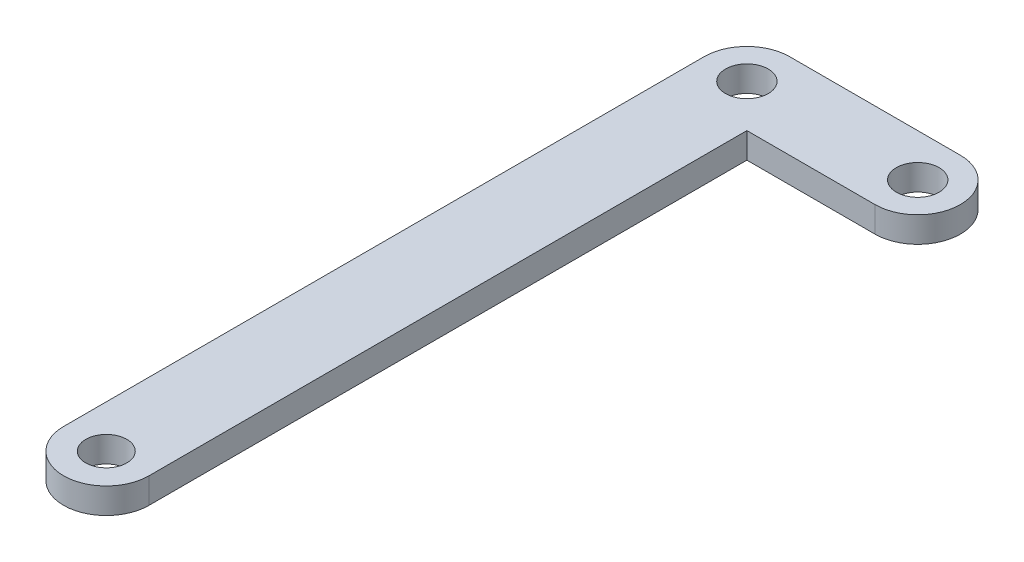
ISO-10303-21;
HEADER;
FILE_DESCRIPTION(('STEP AP214'),'2;1');
FILE_NAME('part.step','',(''),(''),'','','');
FILE_SCHEMA(('AUTOMOTIVE_DESIGN { 1 0 10303 214 1 1 1 1 }'));
ENDSEC;
DATA;
#1=APPLICATION_CONTEXT('core data for automotive mechanical design processes');
#2=APPLICATION_PROTOCOL_DEFINITION('international standard','automotive_design',2000,#1);
#3=PRODUCT_CONTEXT('',#1,'mechanical');
#4=PRODUCT('Part','Part','',(#3));
#5=PRODUCT_RELATED_PRODUCT_CATEGORY('part','',(#4));
#6=PRODUCT_DEFINITION_FORMATION('','',#4);
#7=PRODUCT_DEFINITION_CONTEXT('part definition',#1,'design');
#8=PRODUCT_DEFINITION('design','',#6,#7);
#9=PRODUCT_DEFINITION_SHAPE('','',#8);
#10=(LENGTH_UNIT() NAMED_UNIT(*) SI_UNIT(.MILLI.,.METRE.));
#11=(NAMED_UNIT(*) PLANE_ANGLE_UNIT() SI_UNIT($,.RADIAN.));
#12=(NAMED_UNIT(*) SI_UNIT($,.STERADIAN.) SOLID_ANGLE_UNIT());
#13=UNCERTAINTY_MEASURE_WITH_UNIT(LENGTH_MEASURE(1.E-05),#10,'distance_accuracy_value','');
#14=(GEOMETRIC_REPRESENTATION_CONTEXT(3) GLOBAL_UNCERTAINTY_ASSIGNED_CONTEXT((#13)) GLOBAL_UNIT_ASSIGNED_CONTEXT((#10,
#11,#12)) REPRESENTATION_CONTEXT('',''));
#15=CARTESIAN_POINT('',(0.,0.,0.));
#16=DIRECTION('',(0.,0.,1.));
#17=DIRECTION('',(1.,0.,0.));
#18=AXIS2_PLACEMENT_3D('',#15,#16,#17);
#19=CARTESIAN_POINT('',(29.0687695911701,3.,0.));
#20=DIRECTION('',(-1.,0.,0.));
#21=DIRECTION('',(0.,0.,1.));
#22=AXIS2_PLACEMENT_3D('',#19,#20,#21);
#23=PLANE('',#22);
#24=DIRECTION('',(0.,0.,-1.));
#25=VECTOR('',#24,1.);
#26=CARTESIAN_POINT('',(29.0687695911701,0.,0.));
#27=LINE('',#26,#25);
#28=CARTESIAN_POINT('',(29.0687695911702,0.,48.42576461806));
#29=VERTEX_POINT('',#28);
#30=CARTESIAN_POINT('',(29.0687695911701,0.,-21.57423538194));
#31=VERTEX_POINT('',#30);
#32=EDGE_CURVE('E141',#29,#31,#27,.T.);
#33=ORIENTED_EDGE('',*,*,#32,.T.);
#34=DIRECTION('',(0.,-1.,0.));
#35=VECTOR('',#34,1.);
#36=CARTESIAN_POINT('',(29.0687695911701,3.,-21.57423538194));
#37=LINE('',#36,#35);
#38=CARTESIAN_POINT('',(29.0687695911701,3.,-21.57423538194));
#39=VERTEX_POINT('',#38);
#40=EDGE_CURVE('E11',#39,#31,#37,.T.);
#41=ORIENTED_EDGE('',*,*,#40,.F.);
#42=DIRECTION('',(0.,0.,-1.));
#43=VECTOR('',#42,1.);
#44=CARTESIAN_POINT('',(29.0687695911701,3.,0.));
#45=LINE('',#44,#43);
#46=CARTESIAN_POINT('',(29.0687695911702,3.,48.42576461806));
#47=VERTEX_POINT('',#46);
#48=EDGE_CURVE('E183',#47,#39,#45,.T.);
#49=ORIENTED_EDGE('',*,*,#48,.F.);
#50=DIRECTION('',(0.,-1.,0.));
#51=VECTOR('',#50,1.);
#52=CARTESIAN_POINT('',(29.0687695911702,3.,48.42576461806));
#53=LINE('',#52,#51);
#54=EDGE_CURVE('E137',#47,#29,#53,.T.);
#55=ORIENTED_EDGE('',*,*,#54,.T.);
#56=EDGE_LOOP('',(#33,#41,#49,#55));
#57=FACE_BOUND('',#56,.T.);
#58=ADVANCED_FACE('F41',(#57),#23,.F.);
#59=CARTESIAN_POINT('',(0.,3.,-21.57423538194));
#60=DIRECTION('',(0.,0.,-1.));
#61=DIRECTION('',(-1.,0.,0.));
#62=AXIS2_PLACEMENT_3D('',#59,#60,#61);
#63=PLANE('',#62);
#64=DIRECTION('',(1.,0.,0.));
#65=VECTOR('',#64,1.);
#66=CARTESIAN_POINT('',(0.,0.,-21.57423538194));
#67=LINE('',#66,#65);
#68=CARTESIAN_POINT('',(44.0687695911702,0.,-21.57423538194));
#69=VERTEX_POINT('',#68);
#70=EDGE_CURVE('E144',#31,#69,#67,.T.);
#71=ORIENTED_EDGE('',*,*,#70,.T.);
#72=DIRECTION('',(0.,-1.,0.));
#73=VECTOR('',#72,1.);
#74=CARTESIAN_POINT('',(44.0687695911702,3.,-21.57423538194));
#75=LINE('',#74,#73);
#76=CARTESIAN_POINT('',(44.0687695911702,3.,-21.57423538194));
#77=VERTEX_POINT('',#76);
#78=EDGE_CURVE('E50',#77,#69,#75,.T.);
#79=ORIENTED_EDGE('',*,*,#78,.F.);
#80=DIRECTION('',(1.,0.,0.));
#81=VECTOR('',#80,1.);
#82=CARTESIAN_POINT('',(0.,3.,-21.57423538194));
#83=LINE('',#82,#81);
#84=EDGE_CURVE('E94',#39,#77,#83,.T.);
#85=ORIENTED_EDGE('',*,*,#84,.F.);
#86=ORIENTED_EDGE('',*,*,#40,.T.);
#87=EDGE_LOOP('',(#71,#79,#85,#86));
#88=FACE_BOUND('',#87,.T.);
#89=ADVANCED_FACE('F173',(#88),#63,.F.);
#90=CARTESIAN_POINT('',(44.0687695911702,3.,-26.57423538194));
#91=DIRECTION('',(0.,-1.,0.));
#92=DIRECTION('',(0.,0.,-1.));
#93=AXIS2_PLACEMENT_3D('',#90,#91,#92);
#94=CYLINDRICAL_SURFACE('',#93,5.);
#95=CARTESIAN_POINT('',(44.0687695911702,0.,-26.57423538194));
#96=DIRECTION('',(0.,1.,0.));
#97=DIRECTION('',(0.,0.,1.));
#98=AXIS2_PLACEMENT_3D('',#95,#96,#97);
#99=CIRCLE('',#98,5.);
#100=CARTESIAN_POINT('',(44.0687695911702,0.,-31.57423538194));
#101=VERTEX_POINT('',#100);
#102=EDGE_CURVE('E147',#101,#69,#99,.F.);
#103=ORIENTED_EDGE('',*,*,#102,.F.);
#104=DIRECTION('',(0.,-1.,0.));
#105=VECTOR('',#104,1.);
#106=CARTESIAN_POINT('',(44.0687695911702,3.,-31.57423538194));
#107=LINE('',#106,#105);
#108=CARTESIAN_POINT('',(44.0687695911702,3.,-31.57423538194));
#109=VERTEX_POINT('',#108);
#110=EDGE_CURVE('E167',#109,#101,#107,.T.);
#111=ORIENTED_EDGE('',*,*,#110,.F.);
#112=CARTESIAN_POINT('',(44.0687695911702,3.,-26.57423538194));
#113=DIRECTION('',(0.,1.,0.));
#114=DIRECTION('',(0.,0.,1.));
#115=AXIS2_PLACEMENT_3D('',#112,#113,#114);
#116=CIRCLE('',#115,5.);
#117=EDGE_CURVE('E172',#109,#77,#116,.F.);
#118=ORIENTED_EDGE('',*,*,#117,.T.);
#119=ORIENTED_EDGE('',*,*,#78,.T.);
#120=EDGE_LOOP('',(#103,#111,#118,#119));
#121=FACE_BOUND('',#120,.T.);
#122=ADVANCED_FACE('F171',(#121),#94,.T.);
#123=CARTESIAN_POINT('',(0.,3.,-31.57423538194));
#124=DIRECTION('',(0.,0.,-1.));
#125=DIRECTION('',(-1.,0.,0.));
#126=AXIS2_PLACEMENT_3D('',#123,#124,#125);
#127=PLANE('',#126);
#128=DIRECTION('',(1.,0.,0.));
#129=VECTOR('',#128,1.);
#130=CARTESIAN_POINT('',(0.,0.,-31.57423538194));
#131=LINE('',#130,#129);
#132=CARTESIAN_POINT('',(24.0687695911702,0.,-31.57423538194));
#133=VERTEX_POINT('',#132);
#134=EDGE_CURVE('E150',#133,#101,#131,.T.);
#135=ORIENTED_EDGE('',*,*,#134,.F.);
#136=DIRECTION('',(0.,-1.,0.));
#137=VECTOR('',#136,1.);
#138=CARTESIAN_POINT('',(24.0687695911702,3.,-31.57423538194));
#139=LINE('',#138,#137);
#140=CARTESIAN_POINT('',(24.0687695911702,3.,-31.57423538194));
#141=VERTEX_POINT('',#140);
#142=EDGE_CURVE('E124',#141,#133,#139,.T.);
#143=ORIENTED_EDGE('',*,*,#142,.F.);
#144=DIRECTION('',(1.,0.,0.));
#145=VECTOR('',#144,1.);
#146=CARTESIAN_POINT('',(0.,3.,-31.57423538194));
#147=LINE('',#146,#145);
#148=EDGE_CURVE('E113',#141,#109,#147,.T.);
#149=ORIENTED_EDGE('',*,*,#148,.T.);
#150=ORIENTED_EDGE('',*,*,#110,.T.);
#151=EDGE_LOOP('',(#135,#143,#149,#150));
#152=FACE_BOUND('',#151,.T.);
#153=ADVANCED_FACE('F181',(#152),#127,.T.);
#154=CARTESIAN_POINT('',(24.0687695911702,3.,-26.57423538194));
#155=DIRECTION('',(0.,-1.,0.));
#156=DIRECTION('',(0.,0.,-1.));
#157=AXIS2_PLACEMENT_3D('',#154,#155,#156);
#158=CYLINDRICAL_SURFACE('',#157,5.00000000000002);
#159=CARTESIAN_POINT('',(24.0687695911702,0.,-26.57423538194));
#160=DIRECTION('',(0.,1.,0.));
#161=DIRECTION('',(0.,0.,1.));
#162=AXIS2_PLACEMENT_3D('',#159,#160,#161);
#163=CIRCLE('',#162,5.00000000000002);
#164=CARTESIAN_POINT('',(19.0687695911701,0.,-26.57423538194));
#165=VERTEX_POINT('',#164);
#166=EDGE_CURVE('E120',#133,#165,#163,.T.);
#167=ORIENTED_EDGE('',*,*,#166,.T.);
#168=DIRECTION('',(0.,-1.,0.));
#169=VECTOR('',#168,1.);
#170=CARTESIAN_POINT('',(19.0687695911701,3.,-26.57423538194));
#171=LINE('',#170,#169);
#172=CARTESIAN_POINT('',(19.0687695911701,3.,-26.57423538194));
#173=VERTEX_POINT('',#172);
#174=EDGE_CURVE('E117',#173,#165,#171,.T.);
#175=ORIENTED_EDGE('',*,*,#174,.F.);
#176=CARTESIAN_POINT('',(24.0687695911702,3.,-26.57423538194));
#177=DIRECTION('',(0.,1.,0.));
#178=DIRECTION('',(0.,0.,1.));
#179=AXIS2_PLACEMENT_3D('',#176,#177,#178);
#180=CIRCLE('',#179,5.00000000000002);
#181=EDGE_CURVE('E105',#141,#173,#180,.T.);
#182=ORIENTED_EDGE('',*,*,#181,.F.);
#183=ORIENTED_EDGE('',*,*,#142,.T.);
#184=EDGE_LOOP('',(#167,#175,#182,#183));
#185=FACE_BOUND('',#184,.T.);
#186=ADVANCED_FACE('F118',(#185),#158,.T.);
#187=CARTESIAN_POINT('',(19.0687695911701,3.,0.));
#188=DIRECTION('',(-1.,0.,0.));
#189=DIRECTION('',(0.,0.,1.));
#190=AXIS2_PLACEMENT_3D('',#187,#188,#189);
#191=PLANE('',#190);
#192=DIRECTION('',(0.,0.,-1.));
#193=VECTOR('',#192,1.);
#194=CARTESIAN_POINT('',(19.0687695911701,0.,0.));
#195=LINE('',#194,#193);
#196=CARTESIAN_POINT('',(19.0687695911702,0.,48.42576461806));
#197=VERTEX_POINT('',#196);
#198=EDGE_CURVE('E154',#197,#165,#195,.T.);
#199=ORIENTED_EDGE('',*,*,#198,.F.);
#200=DIRECTION('',(0.,-1.,0.));
#201=VECTOR('',#200,1.);
#202=CARTESIAN_POINT('',(19.0687695911702,3.,48.42576461806));
#203=LINE('',#202,#201);
#204=CARTESIAN_POINT('',(19.0687695911702,3.,48.42576461806));
#205=VERTEX_POINT('',#204);
#206=EDGE_CURVE('E83',#205,#197,#203,.T.);
#207=ORIENTED_EDGE('',*,*,#206,.F.);
#208=DIRECTION('',(0.,0.,-1.));
#209=VECTOR('',#208,1.);
#210=CARTESIAN_POINT('',(19.0687695911701,3.,0.));
#211=LINE('',#210,#209);
#212=EDGE_CURVE('E110',#205,#173,#211,.T.);
#213=ORIENTED_EDGE('',*,*,#212,.T.);
#214=ORIENTED_EDGE('',*,*,#174,.T.);
#215=EDGE_LOOP('',(#199,#207,#213,#214));
#216=FACE_BOUND('',#215,.T.);
#217=ADVANCED_FACE('F126',(#216),#191,.T.);
#218=CARTESIAN_POINT('',(24.0687695911702,3.,48.42576461806));
#219=DIRECTION('',(0.,-1.,0.));
#220=DIRECTION('',(0.,0.,-1.));
#221=AXIS2_PLACEMENT_3D('',#218,#219,#220);
#222=CYLINDRICAL_SURFACE('',#221,2.4);
#223=CARTESIAN_POINT('',(24.0687695911702,3.,48.42576461806));
#224=DIRECTION('',(0.,1.,0.));
#225=DIRECTION('',(0.,0.,1.));
#226=AXIS2_PLACEMENT_3D('',#223,#224,#225);
#227=CIRCLE('',#226,2.4);
#228=CARTESIAN_POINT('',(24.0687695911702,3.,50.82576461806));
#229=VERTEX_POINT('',#228);
#230=EDGE_CURVE('E128',#229,#229,#227,.T.);
#231=ORIENTED_EDGE('',*,*,#230,.T.);
#232=EDGE_LOOP('',(#231));
#233=FACE_BOUND('',#232,.T.);
#234=CARTESIAN_POINT('',(24.0687695911702,0.,48.42576461806));
#235=DIRECTION('',(0.,1.,0.));
#236=DIRECTION('',(0.,0.,1.));
#237=AXIS2_PLACEMENT_3D('',#234,#235,#236);
#238=CIRCLE('',#237,2.4);
#239=CARTESIAN_POINT('',(24.0687695911702,0.,50.82576461806));
#240=VERTEX_POINT('',#239);
#241=EDGE_CURVE('E157',#240,#240,#238,.T.);
#242=ORIENTED_EDGE('',*,*,#241,.F.);
#243=EDGE_LOOP('',(#242));
#244=FACE_BOUND('',#243,.T.);
#245=ADVANCED_FACE('F218',(#233,#244),#222,.F.);
#246=CARTESIAN_POINT('',(24.0687695911702,3.,48.42576461806));
#247=DIRECTION('',(0.,-1.,0.));
#248=DIRECTION('',(0.,0.,-1.));
#249=AXIS2_PLACEMENT_3D('',#246,#247,#248);
#250=CYLINDRICAL_SURFACE('',#249,5.);
#251=CARTESIAN_POINT('',(24.0687695911702,0.,48.42576461806));
#252=DIRECTION('',(0.,1.,0.));
#253=DIRECTION('',(0.,0.,1.));
#254=AXIS2_PLACEMENT_3D('',#251,#252,#253);
#255=CIRCLE('',#254,5.);
#256=EDGE_CURVE('E86',#197,#29,#255,.T.);
#257=ORIENTED_EDGE('',*,*,#256,.T.);
#258=ORIENTED_EDGE('',*,*,#54,.F.);
#259=CARTESIAN_POINT('',(24.0687695911702,3.,48.42576461806));
#260=DIRECTION('',(0.,1.,0.));
#261=DIRECTION('',(0.,0.,1.));
#262=AXIS2_PLACEMENT_3D('',#259,#260,#261);
#263=CIRCLE('',#262,5.);
#264=EDGE_CURVE('E58',#205,#47,#263,.T.);
#265=ORIENTED_EDGE('',*,*,#264,.F.);
#266=ORIENTED_EDGE('',*,*,#206,.T.);
#267=EDGE_LOOP('',(#257,#258,#265,#266));
#268=FACE_BOUND('',#267,.T.);
#269=ADVANCED_FACE('F219',(#268),#250,.T.);
#270=CARTESIAN_POINT('',(24.0687695911702,3.,-26.57423538194));
#271=DIRECTION('',(0.,-1.,0.));
#272=DIRECTION('',(0.,0.,-1.));
#273=AXIS2_PLACEMENT_3D('',#270,#271,#272);
#274=CYLINDRICAL_SURFACE('',#273,2.5);
#275=CARTESIAN_POINT('',(24.0687695911702,3.,-26.57423538194));
#276=DIRECTION('',(0.,1.,0.));
#277=DIRECTION('',(0.,0.,1.));
#278=AXIS2_PLACEMENT_3D('',#275,#276,#277);
#279=CIRCLE('',#278,2.5);
#280=CARTESIAN_POINT('',(24.0687695911702,3.,-24.07423538194));
#281=VERTEX_POINT('',#280);
#282=EDGE_CURVE('E163',#281,#281,#279,.T.);
#283=ORIENTED_EDGE('',*,*,#282,.T.);
#284=EDGE_LOOP('',(#283));
#285=FACE_BOUND('',#284,.T.);
#286=CARTESIAN_POINT('',(24.0687695911702,0.,-26.57423538194));
#287=DIRECTION('',(0.,1.,0.));
#288=DIRECTION('',(0.,0.,1.));
#289=AXIS2_PLACEMENT_3D('',#286,#287,#288);
#290=CIRCLE('',#289,2.5);
#291=CARTESIAN_POINT('',(24.0687695911702,0.,-24.07423538194));
#292=VERTEX_POINT('',#291);
#293=EDGE_CURVE('E138',#292,#292,#290,.T.);
#294=ORIENTED_EDGE('',*,*,#293,.F.);
#295=EDGE_LOOP('',(#294));
#296=FACE_BOUND('',#295,.T.);
#297=ADVANCED_FACE('F43',(#285,#296),#274,.F.);
#298=CARTESIAN_POINT('',(44.0687695911702,3.,-26.57423538194));
#299=DIRECTION('',(0.,-1.,0.));
#300=DIRECTION('',(0.,0.,-1.));
#301=AXIS2_PLACEMENT_3D('',#298,#299,#300);
#302=CYLINDRICAL_SURFACE('',#301,2.5);
#303=CARTESIAN_POINT('',(44.0687695911702,3.,-26.57423538194));
#304=DIRECTION('',(0.,1.,0.));
#305=DIRECTION('',(0.,0.,1.));
#306=AXIS2_PLACEMENT_3D('',#303,#304,#305);
#307=CIRCLE('',#306,2.5);
#308=CARTESIAN_POINT('',(44.0687695911702,3.,-24.07423538194));
#309=VERTEX_POINT('',#308);
#310=EDGE_CURVE('E134',#309,#309,#307,.T.);
#311=ORIENTED_EDGE('',*,*,#310,.T.);
#312=EDGE_LOOP('',(#311));
#313=FACE_BOUND('',#312,.T.);
#314=CARTESIAN_POINT('',(44.0687695911702,0.,-26.57423538194));
#315=DIRECTION('',(0.,1.,0.));
#316=DIRECTION('',(0.,0.,1.));
#317=AXIS2_PLACEMENT_3D('',#314,#315,#316);
#318=CIRCLE('',#317,2.5);
#319=CARTESIAN_POINT('',(44.0687695911702,0.,-24.07423538194));
#320=VERTEX_POINT('',#319);
#321=EDGE_CURVE('E160',#320,#320,#318,.T.);
#322=ORIENTED_EDGE('',*,*,#321,.F.);
#323=EDGE_LOOP('',(#322));
#324=FACE_BOUND('',#323,.T.);
#325=ADVANCED_FACE('F193',(#313,#324),#302,.F.);
#326=CARTESIAN_POINT('',(0.,3.,0.));
#327=DIRECTION('',(0.,1.,0.));
#328=DIRECTION('',(0.,0.,1.));
#329=AXIS2_PLACEMENT_3D('',#326,#327,#328);
#330=PLANE('',#329);
#331=ORIENTED_EDGE('',*,*,#282,.F.);
#332=EDGE_LOOP('',(#331));
#333=FACE_BOUND('',#332,.T.);
#334=ORIENTED_EDGE('',*,*,#48,.T.);
#335=ORIENTED_EDGE('',*,*,#84,.T.);
#336=ORIENTED_EDGE('',*,*,#117,.F.);
#337=ORIENTED_EDGE('',*,*,#148,.F.);
#338=ORIENTED_EDGE('',*,*,#181,.T.);
#339=ORIENTED_EDGE('',*,*,#212,.F.);
#340=ORIENTED_EDGE('',*,*,#264,.T.);
#341=EDGE_LOOP('',(#334,#335,#336,#337,#338,#339,#340));
#342=FACE_BOUND('',#341,.T.);
#343=ORIENTED_EDGE('',*,*,#230,.F.);
#344=EDGE_LOOP('',(#343));
#345=FACE_BOUND('',#344,.T.);
#346=ORIENTED_EDGE('',*,*,#310,.F.);
#347=EDGE_LOOP('',(#346));
#348=FACE_BOUND('',#347,.T.);
#349=ADVANCED_FACE('F107',(#333,#342,#345,#348),#330,.T.);
#350=CARTESIAN_POINT('',(0.,0.,0.));
#351=DIRECTION('',(0.,1.,0.));
#352=DIRECTION('',(0.,0.,1.));
#353=AXIS2_PLACEMENT_3D('',#350,#351,#352);
#354=PLANE('',#353);
#355=ORIENTED_EDGE('',*,*,#293,.T.);
#356=EDGE_LOOP('',(#355));
#357=FACE_BOUND('',#356,.T.);
#358=ORIENTED_EDGE('',*,*,#32,.F.);
#359=ORIENTED_EDGE('',*,*,#256,.F.);
#360=ORIENTED_EDGE('',*,*,#198,.T.);
#361=ORIENTED_EDGE('',*,*,#166,.F.);
#362=ORIENTED_EDGE('',*,*,#134,.T.);
#363=ORIENTED_EDGE('',*,*,#102,.T.);
#364=ORIENTED_EDGE('',*,*,#70,.F.);
#365=EDGE_LOOP('',(#358,#359,#360,#361,#362,#363,#364));
#366=FACE_BOUND('',#365,.T.);
#367=ORIENTED_EDGE('',*,*,#241,.T.);
#368=EDGE_LOOP('',(#367));
#369=FACE_BOUND('',#368,.T.);
#370=ORIENTED_EDGE('',*,*,#321,.T.);
#371=EDGE_LOOP('',(#370));
#372=FACE_BOUND('',#371,.T.);
#373=ADVANCED_FACE('F177',(#357,#366,#369,#372),#354,.F.);
#374=CLOSED_SHELL('',(#58,#89,#122,#153,#186,#217,#245,#269,#297,#325,#349,#373));
#375=MANIFOLD_SOLID_BREP('B2',#374);
#376=ADVANCED_BREP_SHAPE_REPRESENTATION('',(#18,#375),#14);
#377=SHAPE_DEFINITION_REPRESENTATION(#9,#376);
ENDSEC;
END-ISO-10303-21;
